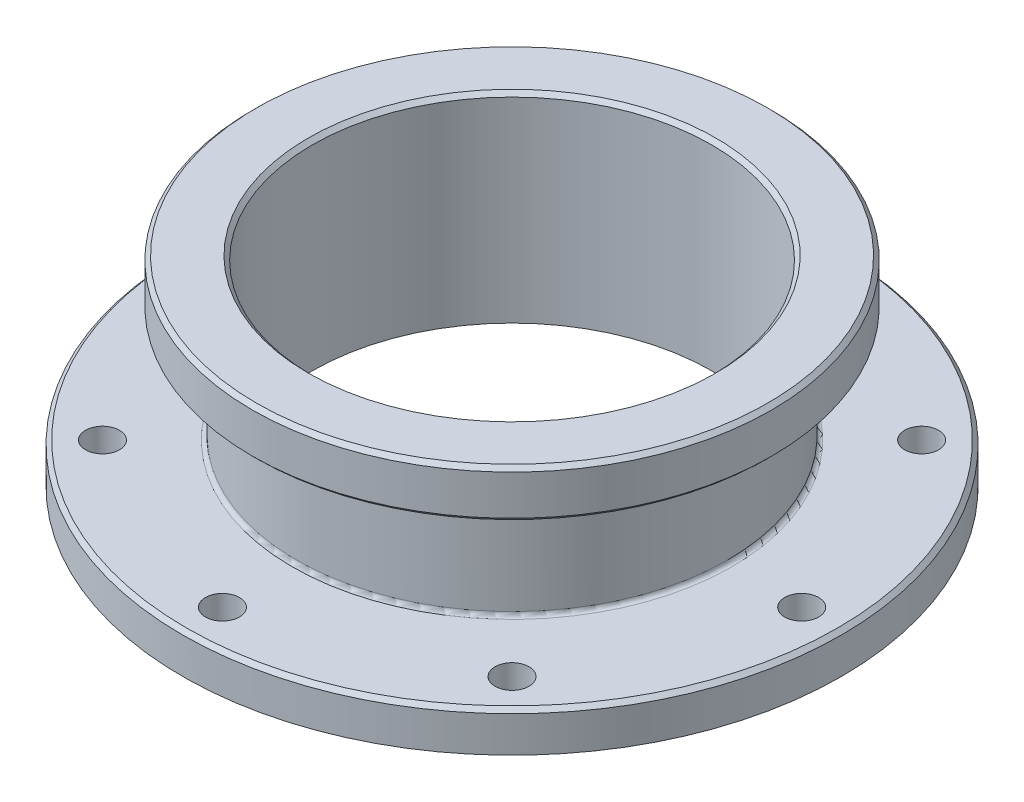
ISO-10303-21;
HEADER;
FILE_DESCRIPTION(('STEP AP214'),'2;1');
FILE_NAME('part.step','',(''),(''),'','','');
FILE_SCHEMA(('AUTOMOTIVE_DESIGN { 1 0 10303 214 1 1 1 1 }'));
ENDSEC;
DATA;
#1=APPLICATION_CONTEXT('core data for automotive mechanical design processes');
#2=APPLICATION_PROTOCOL_DEFINITION('international standard','automotive_design',2000,#1);
#3=PRODUCT_CONTEXT('',#1,'mechanical');
#4=PRODUCT('Part','Part','',(#3));
#5=PRODUCT_RELATED_PRODUCT_CATEGORY('part','',(#4));
#6=PRODUCT_DEFINITION_FORMATION('','',#4);
#7=PRODUCT_DEFINITION_CONTEXT('part definition',#1,'design');
#8=PRODUCT_DEFINITION('design','',#6,#7);
#9=PRODUCT_DEFINITION_SHAPE('','',#8);
#10=(LENGTH_UNIT() NAMED_UNIT(*) SI_UNIT(.MILLI.,.METRE.));
#11=(NAMED_UNIT(*) PLANE_ANGLE_UNIT() SI_UNIT($,.RADIAN.));
#12=(NAMED_UNIT(*) SI_UNIT($,.STERADIAN.) SOLID_ANGLE_UNIT());
#13=UNCERTAINTY_MEASURE_WITH_UNIT(LENGTH_MEASURE(1.E-05),#10,'distance_accuracy_value','');
#14=(GEOMETRIC_REPRESENTATION_CONTEXT(3) GLOBAL_UNCERTAINTY_ASSIGNED_CONTEXT((#13)) GLOBAL_UNIT_ASSIGNED_CONTEXT((#10,
#11,#12)) REPRESENTATION_CONTEXT('',''));
#15=CARTESIAN_POINT('',(0.,0.,0.));
#16=DIRECTION('',(0.,0.,1.));
#17=DIRECTION('',(1.,0.,0.));
#18=AXIS2_PLACEMENT_3D('',#15,#16,#17);
#19=CARTESIAN_POINT('',(72.5,-50.,0.));
#20=DIRECTION('',(0.,1.,0.));
#21=DIRECTION('',(-1.,0.,0.));
#22=AXIS2_PLACEMENT_3D('',#19,#20,#21);
#23=CYLINDRICAL_SURFACE('',#22,4.25);
#24=CARTESIAN_POINT('',(72.5,-50.,0.));
#25=DIRECTION('',(0.,1.,0.));
#26=DIRECTION('',(-1.,0.,0.));
#27=AXIS2_PLACEMENT_3D('',#24,#25,#26);
#28=CIRCLE('',#27,4.25);
#29=CARTESIAN_POINT('',(76.75,-50.,0.));
#30=VERTEX_POINT('',#29);
#31=EDGE_CURVE('E268',#30,#30,#28,.T.);
#32=ORIENTED_EDGE('',*,*,#31,.F.);
#33=DIRECTION('',(0.,1.,0.));
#34=VECTOR('',#33,1.);
#35=CARTESIAN_POINT('',(76.75,-50.,0.));
#36=LINE('',#35,#34);
#37=CARTESIAN_POINT('',(76.75,-40.,0.));
#38=VERTEX_POINT('',#37);
#39=EDGE_CURVE('E11',#30,#38,#36,.T.);
#40=ORIENTED_EDGE('',*,*,#39,.T.);
#41=CARTESIAN_POINT('',(72.5,-40.,0.));
#42=DIRECTION('',(0.,1.,0.));
#43=DIRECTION('',(-1.,0.,0.));
#44=AXIS2_PLACEMENT_3D('',#41,#42,#43);
#45=CIRCLE('',#44,4.25);
#46=EDGE_CURVE('E382',#38,#38,#45,.T.);
#47=ORIENTED_EDGE('',*,*,#46,.T.);
#48=ORIENTED_EDGE('',*,*,#39,.F.);
#49=EDGE_LOOP('',(#32,#40,#47,#48));
#50=FACE_BOUND('',#49,.T.);
#51=ADVANCED_FACE('F17',(#50),#23,.F.);
#52=CARTESIAN_POINT('',(0.,-0.5000000008806,0.));
#53=DIRECTION('',(0.,1.,0.));
#54=DIRECTION('',(0.,0.,-1.));
#55=AXIS2_PLACEMENT_3D('',#52,#53,#54);
#56=CONICAL_SURFACE('',#55,50.49999999912,0.785398163397448);
#57=CARTESIAN_POINT('',(0.,-1.,0.));
#58=DIRECTION('',(0.,-1.,0.));
#59=DIRECTION('',(1.,0.,0.));
#60=AXIS2_PLACEMENT_3D('',#57,#58,#59);
#61=CIRCLE('',#60,50.);
#62=CARTESIAN_POINT('',(0.,-1.0000000000003,50.));
#63=VERTEX_POINT('',#62);
#64=CARTESIAN_POINT('',(50.,-1.,0.));
#65=VERTEX_POINT('',#64);
#66=EDGE_CURVE('E337',#63,#65,#61,.T.);
#67=ORIENTED_EDGE('',*,*,#66,.T.);
#68=CARTESIAN_POINT('',(0.,-1.,0.));
#69=DIRECTION('',(0.,-1.,0.));
#70=DIRECTION('',(1.,0.,0.));
#71=AXIS2_PLACEMENT_3D('',#68,#69,#70);
#72=CIRCLE('',#71,50.);
#73=EDGE_CURVE('E365',#65,#63,#72,.T.);
#74=ORIENTED_EDGE('',*,*,#73,.T.);
#75=DIRECTION('',(0.,0.707106781186548,0.707106781186548));
#76=VECTOR('',#75,1.);
#77=CARTESIAN_POINT('',(0.,-0.5000000008806,50.49999999912));
#78=LINE('',#77,#76);
#79=CARTESIAN_POINT('',(0.,-2.94347879403745E-13,51.));
#80=VERTEX_POINT('',#79);
#81=EDGE_CURVE('E28',#63,#80,#78,.T.);
#82=ORIENTED_EDGE('',*,*,#81,.T.);
#83=CARTESIAN_POINT('',(0.,0.,0.));
#84=DIRECTION('',(0.,-1.,0.));
#85=DIRECTION('',(1.,0.,0.));
#86=AXIS2_PLACEMENT_3D('',#83,#84,#85);
#87=CIRCLE('',#86,51.);
#88=EDGE_CURVE('E293',#80,#80,#87,.T.);
#89=ORIENTED_EDGE('',*,*,#88,.F.);
#90=ORIENTED_EDGE('',*,*,#81,.F.);
#91=EDGE_LOOP('',(#67,#74,#82,#89,#90));
#92=FACE_BOUND('',#91,.T.);
#93=ADVANCED_FACE('F471',(#92),#56,.F.);
#94=CARTESIAN_POINT('',(0.,2.5,0.));
#95=DIRECTION('',(0.,-1.,0.));
#96=DIRECTION('',(-1.,0.,0.));
#97=AXIS2_PLACEMENT_3D('',#94,#95,#96);
#98=CYLINDRICAL_SURFACE('',#97,50.);
#99=ORIENTED_EDGE('',*,*,#66,.F.);
#100=ORIENTED_EDGE('',*,*,#73,.F.);
#101=DIRECTION('',(0.,-1.,0.));
#102=VECTOR('',#101,1.);
#103=CARTESIAN_POINT('',(50.,2.5,0.));
#104=LINE('',#103,#102);
#105=CARTESIAN_POINT('',(50.,-50.,0.));
#106=VERTEX_POINT('',#105);
#107=EDGE_CURVE('E42',#65,#106,#104,.T.);
#108=ORIENTED_EDGE('',*,*,#107,.T.);
#109=CARTESIAN_POINT('',(0.,-50.,0.));
#110=DIRECTION('',(0.,1.,0.));
#111=DIRECTION('',(-1.,0.,0.));
#112=AXIS2_PLACEMENT_3D('',#109,#110,#111);
#113=CIRCLE('',#112,50.);
#114=EDGE_CURVE('E320',#106,#106,#113,.T.);
#115=ORIENTED_EDGE('',*,*,#114,.F.);
#116=ORIENTED_EDGE('',*,*,#107,.F.);
#117=EDGE_LOOP('',(#99,#100,#108,#115,#116));
#118=FACE_BOUND('',#117,.T.);
#119=ADVANCED_FACE('F476',(#118),#98,.F.);
#120=CARTESIAN_POINT('',(0.,-50.,0.));
#121=DIRECTION('',(0.,-1.,0.));
#122=DIRECTION('',(0.,0.,-1.));
#123=AXIS2_PLACEMENT_3D('',#120,#121,#122);
#124=PLANE('',#123);
#125=ORIENTED_EDGE('',*,*,#114,.T.);
#126=EDGE_LOOP('',(#125));
#127=FACE_BOUND('',#126,.T.);
#128=CARTESIAN_POINT('',(0.,-50.,0.));
#129=DIRECTION('',(0.,1.,0.));
#130=DIRECTION('',(-1.,0.,0.));
#131=AXIS2_PLACEMENT_3D('',#128,#129,#130);
#132=CIRCLE('',#131,60.);
#133=CARTESIAN_POINT('',(60.,-50.,0.));
#134=VERTEX_POINT('',#133);
#135=EDGE_CURVE('E321',#134,#134,#132,.T.);
#136=ORIENTED_EDGE('',*,*,#135,.F.);
#137=EDGE_LOOP('',(#136));
#138=FACE_BOUND('',#137,.T.);
#139=ADVANCED_FACE('F740',(#127,#138),#124,.T.);
#140=CARTESIAN_POINT('',(0.,2.5,0.));
#141=DIRECTION('',(0.,-1.,0.));
#142=DIRECTION('',(-1.,0.,0.));
#143=AXIS2_PLACEMENT_3D('',#140,#141,#142);
#144=CYLINDRICAL_SURFACE('',#143,60.);
#145=ORIENTED_EDGE('',*,*,#135,.T.);
#146=DIRECTION('',(0.,1.,0.));
#147=VECTOR('',#146,1.);
#148=CARTESIAN_POINT('',(60.,2.5,0.));
#149=LINE('',#148,#147);
#150=CARTESIAN_POINT('',(60.,-47.,0.));
#151=VERTEX_POINT('',#150);
#152=EDGE_CURVE('E316',#134,#151,#149,.T.);
#153=ORIENTED_EDGE('',*,*,#152,.T.);
#154=CARTESIAN_POINT('',(0.,-47.,0.));
#155=DIRECTION('',(0.,1.,0.));
#156=DIRECTION('',(-1.,0.,0.));
#157=AXIS2_PLACEMENT_3D('',#154,#155,#156);
#158=CIRCLE('',#157,60.);
#159=EDGE_CURVE('E296',#151,#151,#158,.T.);
#160=ORIENTED_EDGE('',*,*,#159,.F.);
#161=ORIENTED_EDGE('',*,*,#152,.F.);
#162=EDGE_LOOP('',(#145,#153,#160,#161));
#163=FACE_BOUND('',#162,.T.);
#164=ADVANCED_FACE('F731',(#163),#144,.T.);
#165=CARTESIAN_POINT('',(0.,-47.,0.));
#166=DIRECTION('',(0.,-1.,0.));
#167=DIRECTION('',(0.,0.,-1.));
#168=AXIS2_PLACEMENT_3D('',#165,#166,#167);
#169=PLANE('',#168);
#170=ORIENTED_EDGE('',*,*,#159,.T.);
#171=EDGE_LOOP('',(#170));
#172=FACE_BOUND('',#171,.T.);
#173=CARTESIAN_POINT('',(0.,-47.,0.));
#174=DIRECTION('',(0.,1.,0.));
#175=DIRECTION('',(-1.,0.,0.));
#176=AXIS2_PLACEMENT_3D('',#173,#174,#175);
#177=CIRCLE('',#176,65.);
#178=CARTESIAN_POINT('',(65.,-47.,0.));
#179=VERTEX_POINT('',#178);
#180=EDGE_CURVE('E278',#179,#179,#177,.T.);
#181=ORIENTED_EDGE('',*,*,#180,.F.);
#182=EDGE_LOOP('',(#181));
#183=FACE_BOUND('',#182,.T.);
#184=ADVANCED_FACE('F728',(#172,#183),#169,.T.);
#185=CARTESIAN_POINT('',(0.,2.5,0.));
#186=DIRECTION('',(0.,-1.,0.));
#187=DIRECTION('',(-1.,0.,0.));
#188=AXIS2_PLACEMENT_3D('',#185,#186,#187);
#189=CYLINDRICAL_SURFACE('',#188,65.);
#190=ORIENTED_EDGE('',*,*,#180,.T.);
#191=DIRECTION('',(0.,-1.,0.));
#192=VECTOR('',#191,1.);
#193=CARTESIAN_POINT('',(65.,2.5,0.));
#194=LINE('',#193,#192);
#195=CARTESIAN_POINT('',(65.,-50.,0.));
#196=VERTEX_POINT('',#195);
#197=EDGE_CURVE('E282',#179,#196,#194,.T.);
#198=ORIENTED_EDGE('',*,*,#197,.T.);
#199=CARTESIAN_POINT('',(0.,-50.,0.));
#200=DIRECTION('',(0.,1.,0.));
#201=DIRECTION('',(-1.,0.,0.));
#202=AXIS2_PLACEMENT_3D('',#199,#200,#201);
#203=CIRCLE('',#202,65.);
#204=EDGE_CURVE('E330',#196,#196,#203,.T.);
#205=ORIENTED_EDGE('',*,*,#204,.F.);
#206=ORIENTED_EDGE('',*,*,#197,.F.);
#207=EDGE_LOOP('',(#190,#198,#205,#206));
#208=FACE_BOUND('',#207,.T.);
#209=ADVANCED_FACE('F480',(#208),#189,.F.);
#210=CARTESIAN_POINT('',(0.,-40.49999999984,-6.69550520788E-13));
#211=DIRECTION('',(0.,-1.,0.));
#212=DIRECTION('',(0.,0.,-1.));
#213=AXIS2_PLACEMENT_3D('',#210,#211,#212);
#214=CONICAL_SURFACE('',#213,81.99999999984,0.785398163397448);
#215=CARTESIAN_POINT('',(0.,-41.,0.));
#216=DIRECTION('',(0.,-1.,0.));
#217=DIRECTION('',(-1.,0.,0.));
#218=AXIS2_PLACEMENT_3D('',#215,#216,#217);
#219=CIRCLE('',#218,82.5);
#220=CARTESIAN_POINT('',(0.,-41.,82.5));
#221=VERTEX_POINT('',#220);
#222=CARTESIAN_POINT('',(82.5,-41.,0.));
#223=VERTEX_POINT('',#222);
#224=EDGE_CURVE('E163',#221,#223,#219,.T.);
#225=ORIENTED_EDGE('',*,*,#224,.F.);
#226=DIRECTION('',(0.,0.707106781186548,-0.707106781186548));
#227=VECTOR('',#226,1.);
#228=CARTESIAN_POINT('',(0.,-40.49999999984,81.9999999998393));
#229=LINE('',#228,#227);
#230=CARTESIAN_POINT('',(0.,-40.,81.499999999999));
#231=VERTEX_POINT('',#230);
#232=EDGE_CURVE('E259',#221,#231,#229,.T.);
#233=ORIENTED_EDGE('',*,*,#232,.T.);
#234=CARTESIAN_POINT('',(0.,-40.,0.));
#235=DIRECTION('',(0.,-1.,0.));
#236=DIRECTION('',(1.,0.,0.));
#237=AXIS2_PLACEMENT_3D('',#234,#235,#236);
#238=CIRCLE('',#237,81.5);
#239=EDGE_CURVE('E242',#231,#231,#238,.T.);
#240=ORIENTED_EDGE('',*,*,#239,.T.);
#241=ORIENTED_EDGE('',*,*,#232,.F.);
#242=CARTESIAN_POINT('',(0.,-41.,0.));
#243=DIRECTION('',(0.,-1.,0.));
#244=DIRECTION('',(-1.,0.,0.));
#245=AXIS2_PLACEMENT_3D('',#242,#243,#244);
#246=CIRCLE('',#245,82.5);
#247=EDGE_CURVE('E260',#223,#221,#246,.T.);
#248=ORIENTED_EDGE('',*,*,#247,.F.);
#249=EDGE_LOOP('',(#225,#233,#240,#241,#248));
#250=FACE_BOUND('',#249,.T.);
#251=ADVANCED_FACE('F451',(#250),#214,.T.);
#252=CARTESIAN_POINT('',(0.,2.5,0.));
#253=DIRECTION('',(0.,-1.,0.));
#254=DIRECTION('',(-1.,0.,0.));
#255=AXIS2_PLACEMENT_3D('',#252,#253,#254);
#256=CYLINDRICAL_SURFACE('',#255,82.5);
#257=CARTESIAN_POINT('',(0.,-50.,0.));
#258=DIRECTION('',(0.,-1.,0.));
#259=DIRECTION('',(-1.,0.,0.));
#260=AXIS2_PLACEMENT_3D('',#257,#258,#259);
#261=CIRCLE('',#260,82.5);
#262=CARTESIAN_POINT('',(82.5,-50.,0.));
#263=VERTEX_POINT('',#262);
#264=EDGE_CURVE('E264',#263,#263,#261,.T.);
#265=ORIENTED_EDGE('',*,*,#264,.F.);
#266=DIRECTION('',(0.,1.,0.));
#267=VECTOR('',#266,1.);
#268=CARTESIAN_POINT('',(82.5,2.5,0.));
#269=LINE('',#268,#267);
#270=EDGE_CURVE('E202',#263,#223,#269,.T.);
#271=ORIENTED_EDGE('',*,*,#270,.T.);
#272=ORIENTED_EDGE('',*,*,#247,.T.);
#273=ORIENTED_EDGE('',*,*,#224,.T.);
#274=ORIENTED_EDGE('',*,*,#270,.F.);
#275=EDGE_LOOP('',(#265,#271,#272,#273,#274));
#276=FACE_BOUND('',#275,.T.);
#277=ADVANCED_FACE('F452',(#276),#256,.T.);
#278=CARTESIAN_POINT('',(51.26524163602,-50.,51.26524163602));
#279=DIRECTION('',(0.,1.,0.));
#280=DIRECTION('',(-1.,0.,0.));
#281=AXIS2_PLACEMENT_3D('',#278,#279,#280);
#282=CYLINDRICAL_SURFACE('',#281,4.25);
#283=CARTESIAN_POINT('',(51.26524163602,-50.,51.26524163602));
#284=DIRECTION('',(0.,1.,0.));
#285=DIRECTION('',(-1.,0.,0.));
#286=AXIS2_PLACEMENT_3D('',#283,#284,#285);
#287=CIRCLE('',#286,4.25);
#288=CARTESIAN_POINT('',(55.51524163602,-50.,51.26524163602));
#289=VERTEX_POINT('',#288);
#290=EDGE_CURVE('E326',#289,#289,#287,.T.);
#291=ORIENTED_EDGE('',*,*,#290,.F.);
#292=DIRECTION('',(0.,1.,0.));
#293=VECTOR('',#292,1.);
#294=CARTESIAN_POINT('',(55.51524163602,-50.,51.26524163602));
#295=LINE('',#294,#293);
#296=CARTESIAN_POINT('',(55.51524163602,-40.,51.26524163602));
#297=VERTEX_POINT('',#296);
#298=EDGE_CURVE('E298',#289,#297,#295,.T.);
#299=ORIENTED_EDGE('',*,*,#298,.T.);
#300=CARTESIAN_POINT('',(51.26524163602,-40.,51.26524163602));
#301=DIRECTION('',(0.,1.,0.));
#302=DIRECTION('',(-1.,0.,0.));
#303=AXIS2_PLACEMENT_3D('',#300,#301,#302);
#304=CIRCLE('',#303,4.25);
#305=EDGE_CURVE('E413',#297,#297,#304,.T.);
#306=ORIENTED_EDGE('',*,*,#305,.T.);
#307=ORIENTED_EDGE('',*,*,#298,.F.);
#308=EDGE_LOOP('',(#291,#299,#306,#307));
#309=FACE_BOUND('',#308,.T.);
#310=ADVANCED_FACE('F902',(#309),#282,.F.);
#311=CARTESIAN_POINT('',(0.,-50.,72.5));
#312=DIRECTION('',(0.,1.,0.));
#313=DIRECTION('',(-1.,0.,0.));
#314=AXIS2_PLACEMENT_3D('',#311,#312,#313);
#315=CYLINDRICAL_SURFACE('',#314,4.25);
#316=CARTESIAN_POINT('',(0.,-50.,72.5));
#317=DIRECTION('',(0.,1.,0.));
#318=DIRECTION('',(-1.,0.,0.));
#319=AXIS2_PLACEMENT_3D('',#316,#317,#318);
#320=CIRCLE('',#319,4.25);
#321=CARTESIAN_POINT('',(4.25,-50.,72.5));
#322=VERTEX_POINT('',#321);
#323=EDGE_CURVE('E331',#322,#322,#320,.T.);
#324=ORIENTED_EDGE('',*,*,#323,.F.);
#325=DIRECTION('',(0.,1.,0.));
#326=VECTOR('',#325,1.);
#327=CARTESIAN_POINT('',(4.25,-50.,72.5));
#328=LINE('',#327,#326);
#329=CARTESIAN_POINT('',(4.25,-40.,72.5));
#330=VERTEX_POINT('',#329);
#331=EDGE_CURVE('E315',#322,#330,#328,.T.);
#332=ORIENTED_EDGE('',*,*,#331,.T.);
#333=CARTESIAN_POINT('',(0.,-40.,72.5));
#334=DIRECTION('',(0.,1.,0.));
#335=DIRECTION('',(-1.,0.,0.));
#336=AXIS2_PLACEMENT_3D('',#333,#334,#335);
#337=CIRCLE('',#336,4.25);
#338=EDGE_CURVE('E387',#330,#330,#337,.T.);
#339=ORIENTED_EDGE('',*,*,#338,.T.);
#340=ORIENTED_EDGE('',*,*,#331,.F.);
#341=EDGE_LOOP('',(#324,#332,#339,#340));
#342=FACE_BOUND('',#341,.T.);
#343=ADVANCED_FACE('F432',(#342),#315,.F.);
#344=CARTESIAN_POINT('',(-51.26524163602,-50.,51.26524163602));
#345=DIRECTION('',(0.,1.,0.));
#346=DIRECTION('',(-1.,0.,0.));
#347=AXIS2_PLACEMENT_3D('',#344,#345,#346);
#348=CYLINDRICAL_SURFACE('',#347,4.25);
#349=CARTESIAN_POINT('',(-51.26524163602,-50.,51.26524163602));
#350=DIRECTION('',(0.,1.,0.));
#351=DIRECTION('',(-1.,0.,0.));
#352=AXIS2_PLACEMENT_3D('',#349,#350,#351);
#353=CIRCLE('',#352,4.25);
#354=CARTESIAN_POINT('',(-47.01524163602,-50.,51.26524163602));
#355=VERTEX_POINT('',#354);
#356=EDGE_CURVE('E390',#355,#355,#353,.T.);
#357=ORIENTED_EDGE('',*,*,#356,.F.);
#358=DIRECTION('',(0.,1.,0.));
#359=VECTOR('',#358,1.);
#360=CARTESIAN_POINT('',(-47.01524163602,-50.,51.26524163602));
#361=LINE('',#360,#359);
#362=CARTESIAN_POINT('',(-47.01524163602,-40.,51.26524163602));
#363=VERTEX_POINT('',#362);
#364=EDGE_CURVE('E352',#355,#363,#361,.T.);
#365=ORIENTED_EDGE('',*,*,#364,.T.);
#366=CARTESIAN_POINT('',(-51.26524163602,-40.,51.26524163602));
#367=DIRECTION('',(0.,1.,0.));
#368=DIRECTION('',(-1.,0.,0.));
#369=AXIS2_PLACEMENT_3D('',#366,#367,#368);
#370=CIRCLE('',#369,4.25);
#371=EDGE_CURVE('E383',#363,#363,#370,.T.);
#372=ORIENTED_EDGE('',*,*,#371,.T.);
#373=ORIENTED_EDGE('',*,*,#364,.F.);
#374=EDGE_LOOP('',(#357,#365,#372,#373));
#375=FACE_BOUND('',#374,.T.);
#376=ADVANCED_FACE('F746',(#375),#348,.F.);
#377=CARTESIAN_POINT('',(-72.5,-50.,0.));
#378=DIRECTION('',(0.,1.,0.));
#379=DIRECTION('',(-1.,0.,0.));
#380=AXIS2_PLACEMENT_3D('',#377,#378,#379);
#381=CYLINDRICAL_SURFACE('',#380,4.25);
#382=CARTESIAN_POINT('',(-72.5,-50.,0.));
#383=DIRECTION('',(0.,1.,0.));
#384=DIRECTION('',(-1.,0.,0.));
#385=AXIS2_PLACEMENT_3D('',#382,#383,#384);
#386=CIRCLE('',#385,4.25);
#387=CARTESIAN_POINT('',(-68.25,-50.,0.));
#388=VERTEX_POINT('',#387);
#389=EDGE_CURVE('E393',#388,#388,#386,.T.);
#390=ORIENTED_EDGE('',*,*,#389,.F.);
#391=DIRECTION('',(0.,1.,0.));
#392=VECTOR('',#391,1.);
#393=CARTESIAN_POINT('',(-68.25,-50.,0.));
#394=LINE('',#393,#392);
#395=CARTESIAN_POINT('',(-68.25,-40.,0.));
#396=VERTEX_POINT('',#395);
#397=EDGE_CURVE('E368',#388,#396,#394,.T.);
#398=ORIENTED_EDGE('',*,*,#397,.T.);
#399=CARTESIAN_POINT('',(-72.5,-40.,0.));
#400=DIRECTION('',(0.,1.,0.));
#401=DIRECTION('',(-1.,0.,0.));
#402=AXIS2_PLACEMENT_3D('',#399,#400,#401);
#403=CIRCLE('',#402,4.25);
#404=EDGE_CURVE('E325',#396,#396,#403,.T.);
#405=ORIENTED_EDGE('',*,*,#404,.T.);
#406=ORIENTED_EDGE('',*,*,#397,.F.);
#407=EDGE_LOOP('',(#390,#398,#405,#406));
#408=FACE_BOUND('',#407,.T.);
#409=ADVANCED_FACE('F744',(#408),#381,.F.);
#410=CARTESIAN_POINT('',(-51.26524163602,-50.,-51.26524163602));
#411=DIRECTION('',(0.,1.,0.));
#412=DIRECTION('',(-1.,0.,0.));
#413=AXIS2_PLACEMENT_3D('',#410,#411,#412);
#414=CYLINDRICAL_SURFACE('',#413,4.25);
#415=CARTESIAN_POINT('',(-51.26524163602,-50.,-51.26524163602));
#416=DIRECTION('',(0.,1.,0.));
#417=DIRECTION('',(-1.,0.,0.));
#418=AXIS2_PLACEMENT_3D('',#415,#416,#417);
#419=CIRCLE('',#418,4.25);
#420=CARTESIAN_POINT('',(-47.01524163602,-50.,-51.26524163602));
#421=VERTEX_POINT('',#420);
#422=EDGE_CURVE('E286',#421,#421,#419,.T.);
#423=ORIENTED_EDGE('',*,*,#422,.F.);
#424=DIRECTION('',(0.,1.,0.));
#425=VECTOR('',#424,1.);
#426=CARTESIAN_POINT('',(-47.01524163602,-50.,-51.26524163602));
#427=LINE('',#426,#425);
#428=CARTESIAN_POINT('',(-47.01524163602,-40.,-51.26524163602));
#429=VERTEX_POINT('',#428);
#430=EDGE_CURVE('E117',#421,#429,#427,.T.);
#431=ORIENTED_EDGE('',*,*,#430,.T.);
#432=CARTESIAN_POINT('',(-51.26524163602,-40.,-51.26524163602));
#433=DIRECTION('',(0.,1.,0.));
#434=DIRECTION('',(-1.,0.,0.));
#435=AXIS2_PLACEMENT_3D('',#432,#433,#434);
#436=CIRCLE('',#435,4.25);
#437=EDGE_CURVE('E322',#429,#429,#436,.T.);
#438=ORIENTED_EDGE('',*,*,#437,.T.);
#439=ORIENTED_EDGE('',*,*,#430,.F.);
#440=EDGE_LOOP('',(#423,#431,#438,#439));
#441=FACE_BOUND('',#440,.T.);
#442=ADVANCED_FACE('F466',(#441),#414,.F.);
#443=CARTESIAN_POINT('',(0.,-50.,-72.5));
#444=DIRECTION('',(0.,1.,0.));
#445=DIRECTION('',(-1.,0.,0.));
#446=AXIS2_PLACEMENT_3D('',#443,#444,#445);
#447=CYLINDRICAL_SURFACE('',#446,4.25);
#448=CARTESIAN_POINT('',(0.,-50.,-72.5));
#449=DIRECTION('',(0.,1.,0.));
#450=DIRECTION('',(-1.,0.,0.));
#451=AXIS2_PLACEMENT_3D('',#448,#449,#450);
#452=CIRCLE('',#451,4.25);
#453=CARTESIAN_POINT('',(4.25,-50.,-72.5));
#454=VERTEX_POINT('',#453);
#455=EDGE_CURVE('E283',#454,#454,#452,.T.);
#456=ORIENTED_EDGE('',*,*,#455,.F.);
#457=DIRECTION('',(0.,1.,0.));
#458=VECTOR('',#457,1.);
#459=CARTESIAN_POINT('',(4.25,-50.,-72.5));
#460=LINE('',#459,#458);
#461=CARTESIAN_POINT('',(4.25,-40.,-72.5));
#462=VERTEX_POINT('',#461);
#463=EDGE_CURVE('E129',#454,#462,#460,.T.);
#464=ORIENTED_EDGE('',*,*,#463,.T.);
#465=CARTESIAN_POINT('',(0.,-40.,-72.5));
#466=DIRECTION('',(0.,1.,0.));
#467=DIRECTION('',(-1.,0.,0.));
#468=AXIS2_PLACEMENT_3D('',#465,#466,#467);
#469=CIRCLE('',#468,4.25);
#470=EDGE_CURVE('E250',#462,#462,#469,.T.);
#471=ORIENTED_EDGE('',*,*,#470,.T.);
#472=ORIENTED_EDGE('',*,*,#463,.F.);
#473=EDGE_LOOP('',(#456,#464,#471,#472));
#474=FACE_BOUND('',#473,.T.);
#475=ADVANCED_FACE('F456',(#474),#447,.F.);
#476=CARTESIAN_POINT('',(0.,-50.,0.));
#477=DIRECTION('',(0.,-1.,0.));
#478=DIRECTION('',(0.,0.,-1.));
#479=AXIS2_PLACEMENT_3D('',#476,#477,#478);
#480=PLANE('',#479);
#481=ORIENTED_EDGE('',*,*,#31,.T.);
#482=EDGE_LOOP('',(#481));
#483=FACE_BOUND('',#482,.T.);
#484=ORIENTED_EDGE('',*,*,#204,.T.);
#485=EDGE_LOOP('',(#484));
#486=FACE_BOUND('',#485,.T.);
#487=CARTESIAN_POINT('',(51.26524163602,-50.,-51.26524163602));
#488=DIRECTION('',(0.,1.,0.));
#489=DIRECTION('',(-1.,0.,0.));
#490=AXIS2_PLACEMENT_3D('',#487,#488,#489);
#491=CIRCLE('',#490,4.25);
#492=CARTESIAN_POINT('',(55.51524163602,-50.,-51.26524163602));
#493=VERTEX_POINT('',#492);
#494=EDGE_CURVE('E265',#493,#493,#491,.T.);
#495=ORIENTED_EDGE('',*,*,#494,.T.);
#496=EDGE_LOOP('',(#495));
#497=FACE_BOUND('',#496,.T.);
#498=ORIENTED_EDGE('',*,*,#290,.T.);
#499=EDGE_LOOP('',(#498));
#500=FACE_BOUND('',#499,.T.);
#501=ORIENTED_EDGE('',*,*,#323,.T.);
#502=EDGE_LOOP('',(#501));
#503=FACE_BOUND('',#502,.T.);
#504=ORIENTED_EDGE('',*,*,#356,.T.);
#505=EDGE_LOOP('',(#504));
#506=FACE_BOUND('',#505,.T.);
#507=ORIENTED_EDGE('',*,*,#389,.T.);
#508=EDGE_LOOP('',(#507));
#509=FACE_BOUND('',#508,.T.);
#510=ORIENTED_EDGE('',*,*,#422,.T.);
#511=EDGE_LOOP('',(#510));
#512=FACE_BOUND('',#511,.T.);
#513=ORIENTED_EDGE('',*,*,#455,.T.);
#514=EDGE_LOOP('',(#513));
#515=FACE_BOUND('',#514,.T.);
#516=ORIENTED_EDGE('',*,*,#264,.T.);
#517=EDGE_LOOP('',(#516));
#518=FACE_BOUND('',#517,.T.);
#519=ADVANCED_FACE('F454',(#483,#486,#497,#500,#503,#506,#509,#512,#515,#518),#480,.T.);
#520=CARTESIAN_POINT('',(51.26524163602,-50.,-51.26524163602));
#521=DIRECTION('',(0.,1.,0.));
#522=DIRECTION('',(-1.,0.,0.));
#523=AXIS2_PLACEMENT_3D('',#520,#521,#522);
#524=CYLINDRICAL_SURFACE('',#523,4.25);
#525=ORIENTED_EDGE('',*,*,#494,.F.);
#526=DIRECTION('',(0.,1.,0.));
#527=VECTOR('',#526,1.);
#528=CARTESIAN_POINT('',(55.51524163602,-50.,-51.26524163602));
#529=LINE('',#528,#527);
#530=CARTESIAN_POINT('',(55.51524163602,-40.,-51.26524163602));
#531=VERTEX_POINT('',#530);
#532=EDGE_CURVE('E261',#493,#531,#529,.T.);
#533=ORIENTED_EDGE('',*,*,#532,.T.);
#534=CARTESIAN_POINT('',(51.26524163602,-40.,-51.26524163602));
#535=DIRECTION('',(0.,1.,0.));
#536=DIRECTION('',(-1.,0.,0.));
#537=AXIS2_PLACEMENT_3D('',#534,#535,#536);
#538=CIRCLE('',#537,4.25);
#539=EDGE_CURVE('E343',#531,#531,#538,.T.);
#540=ORIENTED_EDGE('',*,*,#539,.T.);
#541=ORIENTED_EDGE('',*,*,#532,.F.);
#542=EDGE_LOOP('',(#525,#533,#540,#541));
#543=FACE_BOUND('',#542,.T.);
#544=ADVANCED_FACE('F437',(#543),#524,.F.);
#545=CARTESIAN_POINT('',(0.,-40.,0.));
#546=DIRECTION('',(0.,-1.,0.));
#547=DIRECTION('',(0.,0.,-1.));
#548=AXIS2_PLACEMENT_3D('',#545,#546,#547);
#549=PLANE('',#548);
#550=CARTESIAN_POINT('',(0.,-40.,0.));
#551=DIRECTION('',(0.,1.,0.));
#552=DIRECTION('',(-1.,0.,0.));
#553=AXIS2_PLACEMENT_3D('',#550,#551,#552);
#554=CIRCLE('',#553,55.);
#555=CARTESIAN_POINT('',(54.997436759997,-40.,0.530989482130536));
#556=VERTEX_POINT('',#555);
#557=EDGE_CURVE('E237',#556,#556,#554,.T.);
#558=ORIENTED_EDGE('',*,*,#557,.F.);
#559=EDGE_LOOP('',(#558));
#560=FACE_BOUND('',#559,.T.);
#561=ORIENTED_EDGE('',*,*,#539,.F.);
#562=EDGE_LOOP('',(#561));
#563=FACE_BOUND('',#562,.T.);
#564=ORIENTED_EDGE('',*,*,#46,.F.);
#565=EDGE_LOOP('',(#564));
#566=FACE_BOUND('',#565,.T.);
#567=ORIENTED_EDGE('',*,*,#305,.F.);
#568=EDGE_LOOP('',(#567));
#569=FACE_BOUND('',#568,.T.);
#570=ORIENTED_EDGE('',*,*,#338,.F.);
#571=EDGE_LOOP('',(#570));
#572=FACE_BOUND('',#571,.T.);
#573=ORIENTED_EDGE('',*,*,#371,.F.);
#574=EDGE_LOOP('',(#573));
#575=FACE_BOUND('',#574,.T.);
#576=ORIENTED_EDGE('',*,*,#404,.F.);
#577=EDGE_LOOP('',(#576));
#578=FACE_BOUND('',#577,.T.);
#579=ORIENTED_EDGE('',*,*,#437,.F.);
#580=EDGE_LOOP('',(#579));
#581=FACE_BOUND('',#580,.T.);
#582=ORIENTED_EDGE('',*,*,#470,.F.);
#583=EDGE_LOOP('',(#582));
#584=FACE_BOUND('',#583,.T.);
#585=ORIENTED_EDGE('',*,*,#239,.F.);
#586=EDGE_LOOP('',(#585));
#587=FACE_BOUND('',#586,.T.);
#588=ADVANCED_FACE('F434',(#560,#563,#566,#569,#572,#575,#578,#581,#584,#587),#549,.F.);
#589=CARTESIAN_POINT('',(0.,-39.,0.));
#590=DIRECTION('',(0.,-1.,0.));
#591=DIRECTION('',(-0.999953395636309,0.,-0.00965435422055508));
#592=AXIS2_PLACEMENT_3D('',#589,#590,#591);
#593=TOROIDAL_SURFACE('',#592,55.,1.);
#594=ORIENTED_EDGE('',*,*,#557,.T.);
#595=CARTESIAN_POINT('',(54.997436759997,-39.,0.530989482130536));
#596=DIRECTION('',(0.00965435422055521,0.,-0.999953395636309));
#597=DIRECTION('',(0.999953395636309,0.,0.00965435422055521));
#598=AXIS2_PLACEMENT_3D('',#595,#596,#597);
#599=CIRCLE('',#598,1.);
#600=CARTESIAN_POINT('',(53.9974833643607,-39.,0.521335127909981));
#601=VERTEX_POINT('',#600);
#602=EDGE_CURVE('E230',#556,#601,#599,.T.);
#603=ORIENTED_EDGE('',*,*,#602,.T.);
#604=CARTESIAN_POINT('',(0.,-39.,0.));
#605=DIRECTION('',(0.,1.,0.));
#606=DIRECTION('',(-1.,0.,0.));
#607=AXIS2_PLACEMENT_3D('',#604,#605,#606);
#608=CIRCLE('',#607,54.);
#609=CARTESIAN_POINT('',(54.,-39.,0.));
#610=VERTEX_POINT('',#609);
#611=EDGE_CURVE('E377',#610,#601,#608,.T.);
#612=ORIENTED_EDGE('',*,*,#611,.F.);
#613=CARTESIAN_POINT('',(0.,-39.,0.));
#614=DIRECTION('',(0.,1.,0.));
#615=DIRECTION('',(-1.,0.,0.));
#616=AXIS2_PLACEMENT_3D('',#613,#614,#615);
#617=CIRCLE('',#616,54.);
#618=EDGE_CURVE('E239',#601,#610,#617,.T.);
#619=ORIENTED_EDGE('',*,*,#618,.F.);
#620=ORIENTED_EDGE('',*,*,#602,.F.);
#621=EDGE_LOOP('',(#594,#603,#612,#619,#620));
#622=FACE_BOUND('',#621,.T.);
#623=ADVANCED_FACE('F235',(#622),#593,.F.);
#624=CARTESIAN_POINT('',(0.,2.5,0.));
#625=DIRECTION('',(0.,-1.,0.));
#626=DIRECTION('',(-1.,0.,0.));
#627=AXIS2_PLACEMENT_3D('',#624,#625,#626);
#628=CYLINDRICAL_SURFACE('',#627,54.);
#629=ORIENTED_EDGE('',*,*,#611,.T.);
#630=ORIENTED_EDGE('',*,*,#618,.T.);
#631=DIRECTION('',(0.,1.,0.));
#632=VECTOR('',#631,1.);
#633=CARTESIAN_POINT('',(54.,2.5,0.));
#634=LINE('',#633,#632);
#635=CARTESIAN_POINT('',(54.,-10.,0.));
#636=VERTEX_POINT('',#635);
#637=EDGE_CURVE('E252',#610,#636,#634,.T.);
#638=ORIENTED_EDGE('',*,*,#637,.T.);
#639=CARTESIAN_POINT('',(0.,-10.,0.));
#640=DIRECTION('',(0.,1.,0.));
#641=DIRECTION('',(-1.,0.,0.));
#642=AXIS2_PLACEMENT_3D('',#639,#640,#641);
#643=CIRCLE('',#642,54.);
#644=EDGE_CURVE('E420',#636,#636,#643,.T.);
#645=ORIENTED_EDGE('',*,*,#644,.F.);
#646=ORIENTED_EDGE('',*,*,#637,.F.);
#647=EDGE_LOOP('',(#629,#630,#638,#645,#646));
#648=FACE_BOUND('',#647,.T.);
#649=ADVANCED_FACE('F675',(#648),#628,.T.);
#650=CARTESIAN_POINT('',(0.,-10.,0.));
#651=DIRECTION('',(0.,-1.,0.));
#652=DIRECTION('',(0.,0.,-1.));
#653=AXIS2_PLACEMENT_3D('',#650,#651,#652);
#654=PLANE('',#653);
#655=ORIENTED_EDGE('',*,*,#644,.T.);
#656=EDGE_LOOP('',(#655));
#657=FACE_BOUND('',#656,.T.);
#658=CARTESIAN_POINT('',(0.,-10.,0.));
#659=DIRECTION('',(0.,1.,0.));
#660=DIRECTION('',(-1.,0.,0.));
#661=AXIS2_PLACEMENT_3D('',#658,#659,#660);
#662=CIRCLE('',#661,62.5);
#663=CARTESIAN_POINT('',(62.5,-10.,0.));
#664=VERTEX_POINT('',#663);
#665=EDGE_CURVE('E300',#664,#664,#662,.T.);
#666=ORIENTED_EDGE('',*,*,#665,.F.);
#667=EDGE_LOOP('',(#666));
#668=FACE_BOUND('',#667,.T.);
#669=ADVANCED_FACE('F485',(#657,#668),#654,.T.);
#670=CARTESIAN_POINT('',(0.,2.5,0.));
#671=DIRECTION('',(0.,-1.,0.));
#672=DIRECTION('',(-1.,0.,0.));
#673=AXIS2_PLACEMENT_3D('',#670,#671,#672);
#674=CYLINDRICAL_SURFACE('',#673,62.5);
#675=ORIENTED_EDGE('',*,*,#665,.T.);
#676=DIRECTION('',(0.,-1.,0.));
#677=VECTOR('',#676,1.);
#678=CARTESIAN_POINT('',(62.5,2.5,0.));
#679=LINE('',#678,#677);
#680=CARTESIAN_POINT('',(62.5,-12.,0.));
#681=VERTEX_POINT('',#680);
#682=EDGE_CURVE('E304',#664,#681,#679,.T.);
#683=ORIENTED_EDGE('',*,*,#682,.T.);
#684=CARTESIAN_POINT('',(0.,-12.,0.));
#685=DIRECTION('',(0.,1.,0.));
#686=DIRECTION('',(-1.,0.,0.));
#687=AXIS2_PLACEMENT_3D('',#684,#685,#686);
#688=CIRCLE('',#687,62.5);
#689=EDGE_CURVE('E305',#681,#681,#688,.T.);
#690=ORIENTED_EDGE('',*,*,#689,.F.);
#691=ORIENTED_EDGE('',*,*,#682,.F.);
#692=EDGE_LOOP('',(#675,#683,#690,#691));
#693=FACE_BOUND('',#692,.T.);
#694=ADVANCED_FACE('F482',(#693),#674,.F.);
#695=CARTESIAN_POINT('',(0.,-12.,0.));
#696=DIRECTION('',(0.,-1.,0.));
#697=DIRECTION('',(0.,0.,-1.));
#698=AXIS2_PLACEMENT_3D('',#695,#696,#697);
#699=PLANE('',#698);
#700=ORIENTED_EDGE('',*,*,#689,.T.);
#701=EDGE_LOOP('',(#700));
#702=FACE_BOUND('',#701,.T.);
#703=CARTESIAN_POINT('',(0.,-12.,-4.142524880428E-13));
#704=DIRECTION('',(0.,-1.,0.));
#705=DIRECTION('',(-1.,0.,0.));
#706=AXIS2_PLACEMENT_3D('',#703,#704,#705);
#707=CIRCLE('',#706,64.);
#708=CARTESIAN_POINT('',(0.,-12.,64.));
#709=VERTEX_POINT('',#708);
#710=EDGE_CURVE('E273',#709,#709,#707,.T.);
#711=ORIENTED_EDGE('',*,*,#710,.T.);
#712=EDGE_LOOP('',(#711));
#713=FACE_BOUND('',#712,.T.);
#714=ADVANCED_FACE('F484',(#702,#713),#699,.T.);
#715=CARTESIAN_POINT('',(0.,-11.50000000044,-4.142524880428E-13));
#716=DIRECTION('',(0.,1.,0.));
#717=DIRECTION('',(0.,0.,-1.));
#718=AXIS2_PLACEMENT_3D('',#715,#716,#717);
#719=CONICAL_SURFACE('',#718,64.49999999956,0.785398163397448);
#720=CARTESIAN_POINT('',(0.,-11.,0.));
#721=DIRECTION('',(0.,-1.,0.));
#722=DIRECTION('',(1.,0.,0.));
#723=AXIS2_PLACEMENT_3D('',#720,#721,#722);
#724=CIRCLE('',#723,65.);
#725=CARTESIAN_POINT('',(65.,-11.,0.));
#726=VERTEX_POINT('',#725);
#727=CARTESIAN_POINT('',(0.,-10.9999999999998,65.));
#728=VERTEX_POINT('',#727);
#729=EDGE_CURVE('E277',#726,#728,#724,.T.);
#730=ORIENTED_EDGE('',*,*,#729,.T.);
#731=DIRECTION('',(0.,-0.707106781186548,-0.707106781186548));
#732=VECTOR('',#731,1.);
#733=CARTESIAN_POINT('',(0.,-11.50000000044,64.4999999995596));
#734=LINE('',#733,#732);
#735=EDGE_CURVE('E269',#728,#709,#734,.T.);
#736=ORIENTED_EDGE('',*,*,#735,.T.);
#737=ORIENTED_EDGE('',*,*,#710,.F.);
#738=ORIENTED_EDGE('',*,*,#735,.F.);
#739=CARTESIAN_POINT('',(0.,-11.,0.));
#740=DIRECTION('',(0.,-1.,0.));
#741=DIRECTION('',(1.,0.,0.));
#742=AXIS2_PLACEMENT_3D('',#739,#740,#741);
#743=CIRCLE('',#742,65.);
#744=EDGE_CURVE('E21',#728,#726,#743,.T.);
#745=ORIENTED_EDGE('',*,*,#744,.T.);
#746=EDGE_LOOP('',(#730,#736,#737,#738,#745));
#747=FACE_BOUND('',#746,.T.);
#748=ADVANCED_FACE('F19',(#747),#719,.T.);
#749=CARTESIAN_POINT('',(0.,2.5,0.));
#750=DIRECTION('',(0.,-1.,0.));
#751=DIRECTION('',(-1.,0.,0.));
#752=AXIS2_PLACEMENT_3D('',#749,#750,#751);
#753=CYLINDRICAL_SURFACE('',#752,65.);
#754=ORIENTED_EDGE('',*,*,#729,.F.);
#755=DIRECTION('',(0.,1.,0.));
#756=VECTOR('',#755,1.);
#757=CARTESIAN_POINT('',(65.,2.5,0.));
#758=LINE('',#757,#756);
#759=CARTESIAN_POINT('',(65.,-1.,0.));
#760=VERTEX_POINT('',#759);
#761=EDGE_CURVE('E274',#726,#760,#758,.T.);
#762=ORIENTED_EDGE('',*,*,#761,.T.);
#763=CARTESIAN_POINT('',(0.,-1.,0.));
#764=DIRECTION('',(0.,-1.,0.));
#765=DIRECTION('',(1.,0.,0.));
#766=AXIS2_PLACEMENT_3D('',#763,#764,#765);
#767=CIRCLE('',#766,65.);
#768=CARTESIAN_POINT('',(0.,-1.0000000000019,64.9999999999981));
#769=VERTEX_POINT('',#768);
#770=EDGE_CURVE('E61',#760,#769,#767,.T.);
#771=ORIENTED_EDGE('',*,*,#770,.T.);
#772=CARTESIAN_POINT('',(0.,-1.,0.));
#773=DIRECTION('',(0.,-1.,0.));
#774=DIRECTION('',(1.,0.,0.));
#775=AXIS2_PLACEMENT_3D('',#772,#773,#774);
#776=CIRCLE('',#775,65.);
#777=EDGE_CURVE('E289',#769,#760,#776,.T.);
#778=ORIENTED_EDGE('',*,*,#777,.T.);
#779=ORIENTED_EDGE('',*,*,#761,.F.);
#780=ORIENTED_EDGE('',*,*,#744,.F.);
#781=EDGE_LOOP('',(#754,#762,#771,#778,#779,#780));
#782=FACE_BOUND('',#781,.T.);
#783=ADVANCED_FACE('F492',(#782),#753,.T.);
#784=CARTESIAN_POINT('',(0.,-0.4999999997438,0.));
#785=DIRECTION('',(0.,-1.,0.));
#786=DIRECTION('',(0.,0.,-1.));
#787=AXIS2_PLACEMENT_3D('',#784,#785,#786);
#788=CONICAL_SURFACE('',#787,64.49999999974,0.785398163397448);
#789=ORIENTED_EDGE('',*,*,#777,.F.);
#790=DIRECTION('',(0.,0.707106781186548,-0.707106781186548));
#791=VECTOR('',#790,1.);
#792=CARTESIAN_POINT('',(0.,-0.4999999997438,64.49999999974));
#793=LINE('',#792,#791);
#794=CARTESIAN_POINT('',(0.,-1.89688542651112E-12,63.9999999999981));
#795=VERTEX_POINT('',#794);
#796=EDGE_CURVE('E292',#769,#795,#793,.T.);
#797=ORIENTED_EDGE('',*,*,#796,.T.);
#798=CARTESIAN_POINT('',(0.,0.,0.));
#799=DIRECTION('',(0.,-1.,0.));
#800=DIRECTION('',(1.,0.,0.));
#801=AXIS2_PLACEMENT_3D('',#798,#799,#800);
#802=CIRCLE('',#801,64.);
#803=EDGE_CURVE('E306',#795,#795,#802,.T.);
#804=ORIENTED_EDGE('',*,*,#803,.T.);
#805=ORIENTED_EDGE('',*,*,#796,.F.);
#806=ORIENTED_EDGE('',*,*,#770,.F.);
#807=EDGE_LOOP('',(#789,#797,#804,#805,#806));
#808=FACE_BOUND('',#807,.T.);
#809=ADVANCED_FACE('F733',(#808),#788,.T.);
#810=CARTESIAN_POINT('',(0.,0.,0.));
#811=DIRECTION('',(0.,-1.,0.));
#812=DIRECTION('',(0.,0.,-1.));
#813=AXIS2_PLACEMENT_3D('',#810,#811,#812);
#814=PLANE('',#813);
#815=ORIENTED_EDGE('',*,*,#88,.T.);
#816=EDGE_LOOP('',(#815));
#817=FACE_BOUND('',#816,.T.);
#818=ORIENTED_EDGE('',*,*,#803,.F.);
#819=EDGE_LOOP('',(#818));
#820=FACE_BOUND('',#819,.T.);
#821=ADVANCED_FACE('F736',(#817,#820),#814,.F.);
#822=CLOSED_SHELL('',(#51,#93,#119,#139,#164,#184,#209,#251,#277,#310,#343,#376,#409,#442,#475,
#519,#544,#588,#623,#649,#669,#694,#714,#748,#783,#809,#821));
#823=MANIFOLD_SOLID_BREP('B1',#822);
#824=ADVANCED_BREP_SHAPE_REPRESENTATION('',(#18,#823),#14);
#825=SHAPE_DEFINITION_REPRESENTATION(#9,#824);
ENDSEC;
END-ISO-10303-21;
